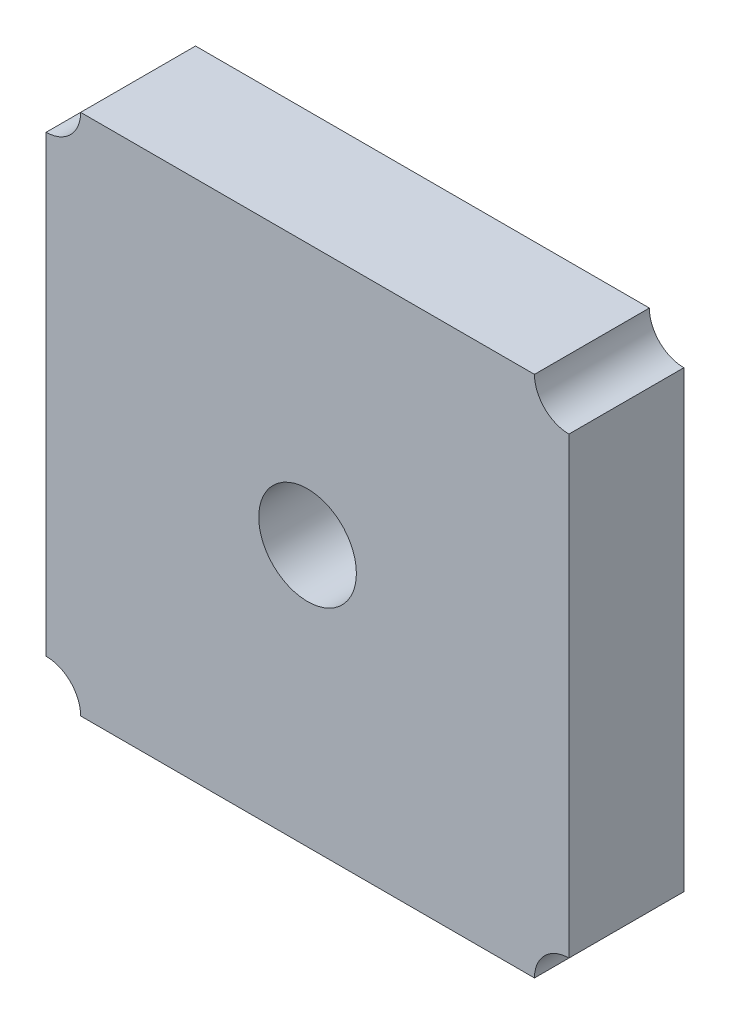
ISO-10303-21;
HEADER;
FILE_DESCRIPTION(('STEP AP214'),'2;1');
FILE_NAME('part.step','',(''),(''),'','','');
FILE_SCHEMA(('AUTOMOTIVE_DESIGN { 1 0 10303 214 1 1 1 1 }'));
ENDSEC;
DATA;
#1=APPLICATION_CONTEXT('core data for automotive mechanical design processes');
#2=APPLICATION_PROTOCOL_DEFINITION('international standard','automotive_design',2000,#1);
#3=PRODUCT_CONTEXT('',#1,'mechanical');
#4=PRODUCT('Part','Part','',(#3));
#5=PRODUCT_RELATED_PRODUCT_CATEGORY('part','',(#4));
#6=PRODUCT_DEFINITION_FORMATION('','',#4);
#7=PRODUCT_DEFINITION_CONTEXT('part definition',#1,'design');
#8=PRODUCT_DEFINITION('design','',#6,#7);
#9=PRODUCT_DEFINITION_SHAPE('','',#8);
#10=(LENGTH_UNIT() NAMED_UNIT(*) SI_UNIT(.MILLI.,.METRE.));
#11=(NAMED_UNIT(*) PLANE_ANGLE_UNIT() SI_UNIT($,.RADIAN.));
#12=(NAMED_UNIT(*) SI_UNIT($,.STERADIAN.) SOLID_ANGLE_UNIT());
#13=UNCERTAINTY_MEASURE_WITH_UNIT(LENGTH_MEASURE(1.E-05),#10,'distance_accuracy_value','');
#14=(GEOMETRIC_REPRESENTATION_CONTEXT(3) GLOBAL_UNCERTAINTY_ASSIGNED_CONTEXT((#13)) GLOBAL_UNIT_ASSIGNED_CONTEXT((#10,
#11,#12)) REPRESENTATION_CONTEXT('',''));
#15=CARTESIAN_POINT('',(0.,0.,0.));
#16=DIRECTION('',(0.,0.,1.));
#17=DIRECTION('',(1.,0.,0.));
#18=AXIS2_PLACEMENT_3D('',#15,#16,#17);
#19=CARTESIAN_POINT('',(0.,0.,10.));
#20=DIRECTION('',(0.,0.,-1.));
#21=DIRECTION('',(-1.,0.,0.));
#22=AXIS2_PLACEMENT_3D('',#19,#20,#21);
#23=CYLINDRICAL_SURFACE('',#22,3.);
#24=CARTESIAN_POINT('',(0.,0.,0.));
#25=DIRECTION('',(0.,0.,1.));
#26=DIRECTION('',(1.,0.,0.));
#27=AXIS2_PLACEMENT_3D('',#24,#25,#26);
#28=CIRCLE('',#27,3.);
#29=CARTESIAN_POINT('',(0.,-3.,0.));
#30=VERTEX_POINT('',#29);
#31=CARTESIAN_POINT('',(3.,0.,0.));
#32=VERTEX_POINT('',#31);
#33=EDGE_CURVE('E134',#30,#32,#28,.T.);
#34=ORIENTED_EDGE('',*,*,#33,.F.);
#35=DIRECTION('',(0.,0.,-1.));
#36=VECTOR('',#35,1.);
#37=CARTESIAN_POINT('',(0.,-3.,10.));
#38=LINE('',#37,#36);
#39=CARTESIAN_POINT('',(0.,-3.,10.));
#40=VERTEX_POINT('',#39);
#41=EDGE_CURVE('E11',#40,#30,#38,.T.);
#42=ORIENTED_EDGE('',*,*,#41,.F.);
#43=CARTESIAN_POINT('',(0.,0.,10.));
#44=DIRECTION('',(0.,0.,1.));
#45=DIRECTION('',(1.,0.,0.));
#46=AXIS2_PLACEMENT_3D('',#43,#44,#45);
#47=CIRCLE('',#46,3.);
#48=CARTESIAN_POINT('',(3.,0.,10.));
#49=VERTEX_POINT('',#48);
#50=EDGE_CURVE('E156',#40,#49,#47,.T.);
#51=ORIENTED_EDGE('',*,*,#50,.T.);
#52=DIRECTION('',(0.,0.,-1.));
#53=VECTOR('',#52,1.);
#54=CARTESIAN_POINT('',(3.,0.,10.));
#55=LINE('',#54,#53);
#56=EDGE_CURVE('E51',#49,#32,#55,.T.);
#57=ORIENTED_EDGE('',*,*,#56,.T.);
#58=EDGE_LOOP('',(#34,#42,#51,#57));
#59=FACE_BOUND('',#58,.T.);
#60=ADVANCED_FACE('F35',(#59),#23,.F.);
#61=CARTESIAN_POINT('',(0.,0.,10.));
#62=DIRECTION('',(1.,0.,0.));
#63=DIRECTION('',(0.,1.,0.));
#64=AXIS2_PLACEMENT_3D('',#61,#62,#63);
#65=PLANE('',#64);
#66=DIRECTION('',(0.,-1.,0.));
#67=VECTOR('',#66,1.);
#68=CARTESIAN_POINT('',(0.,0.,0.));
#69=LINE('',#68,#67);
#70=CARTESIAN_POINT('',(0.,-42.5,0.));
#71=VERTEX_POINT('',#70);
#72=EDGE_CURVE('E136',#30,#71,#69,.T.);
#73=ORIENTED_EDGE('',*,*,#72,.T.);
#74=DIRECTION('',(0.,0.,-1.));
#75=VECTOR('',#74,1.);
#76=CARTESIAN_POINT('',(0.,-42.5,10.));
#77=LINE('',#76,#75);
#78=CARTESIAN_POINT('',(0.,-42.5,10.));
#79=VERTEX_POINT('',#78);
#80=EDGE_CURVE('E43',#79,#71,#77,.T.);
#81=ORIENTED_EDGE('',*,*,#80,.F.);
#82=DIRECTION('',(0.,-1.,0.));
#83=VECTOR('',#82,1.);
#84=CARTESIAN_POINT('',(0.,0.,10.));
#85=LINE('',#84,#83);
#86=EDGE_CURVE('E277',#40,#79,#85,.T.);
#87=ORIENTED_EDGE('',*,*,#86,.F.);
#88=ORIENTED_EDGE('',*,*,#41,.T.);
#89=EDGE_LOOP('',(#73,#81,#87,#88));
#90=FACE_BOUND('',#89,.T.);
#91=ADVANCED_FACE('F173',(#90),#65,.F.);
#92=CARTESIAN_POINT('',(0.,-45.5,10.));
#93=DIRECTION('',(0.,0.,-1.));
#94=DIRECTION('',(-1.,0.,0.));
#95=AXIS2_PLACEMENT_3D('',#92,#93,#94);
#96=CYLINDRICAL_SURFACE('',#95,3.);
#97=CARTESIAN_POINT('',(0.,-45.5,0.));
#98=DIRECTION('',(0.,0.,1.));
#99=DIRECTION('',(1.,0.,0.));
#100=AXIS2_PLACEMENT_3D('',#97,#98,#99);
#101=CIRCLE('',#100,3.);
#102=CARTESIAN_POINT('',(3.,-45.5,0.));
#103=VERTEX_POINT('',#102);
#104=EDGE_CURVE('E139',#103,#71,#101,.T.);
#105=ORIENTED_EDGE('',*,*,#104,.F.);
#106=DIRECTION('',(0.,0.,-1.));
#107=VECTOR('',#106,1.);
#108=CARTESIAN_POINT('',(3.,-45.5,10.));
#109=LINE('',#108,#107);
#110=CARTESIAN_POINT('',(3.,-45.5,10.));
#111=VERTEX_POINT('',#110);
#112=EDGE_CURVE('E163',#111,#103,#109,.T.);
#113=ORIENTED_EDGE('',*,*,#112,.F.);
#114=CARTESIAN_POINT('',(0.,-45.5,10.));
#115=DIRECTION('',(0.,0.,1.));
#116=DIRECTION('',(1.,0.,0.));
#117=AXIS2_PLACEMENT_3D('',#114,#115,#116);
#118=CIRCLE('',#117,3.);
#119=EDGE_CURVE('E170',#111,#79,#118,.T.);
#120=ORIENTED_EDGE('',*,*,#119,.T.);
#121=ORIENTED_EDGE('',*,*,#80,.T.);
#122=EDGE_LOOP('',(#105,#113,#120,#121));
#123=FACE_BOUND('',#122,.T.);
#124=ADVANCED_FACE('F168',(#123),#96,.F.);
#125=CARTESIAN_POINT('',(0.,-45.5,10.));
#126=DIRECTION('',(0.,1.,0.));
#127=DIRECTION('',(0.,0.,1.));
#128=AXIS2_PLACEMENT_3D('',#125,#126,#127);
#129=PLANE('',#128);
#130=DIRECTION('',(1.,0.,0.));
#131=VECTOR('',#130,1.);
#132=CARTESIAN_POINT('',(0.,-45.5,0.));
#133=LINE('',#132,#131);
#134=CARTESIAN_POINT('',(42.5,-45.5,0.));
#135=VERTEX_POINT('',#134);
#136=EDGE_CURVE('E142',#103,#135,#133,.T.);
#137=ORIENTED_EDGE('',*,*,#136,.T.);
#138=DIRECTION('',(0.,0.,-1.));
#139=VECTOR('',#138,1.);
#140=CARTESIAN_POINT('',(42.5,-45.5,10.));
#141=LINE('',#140,#139);
#142=CARTESIAN_POINT('',(42.5,-45.5,10.));
#143=VERTEX_POINT('',#142);
#144=EDGE_CURVE('E160',#143,#135,#141,.T.);
#145=ORIENTED_EDGE('',*,*,#144,.F.);
#146=DIRECTION('',(1.,0.,0.));
#147=VECTOR('',#146,1.);
#148=CARTESIAN_POINT('',(0.,-45.5,10.));
#149=LINE('',#148,#147);
#150=EDGE_CURVE('E126',#111,#143,#149,.T.);
#151=ORIENTED_EDGE('',*,*,#150,.F.);
#152=ORIENTED_EDGE('',*,*,#112,.T.);
#153=EDGE_LOOP('',(#137,#145,#151,#152));
#154=FACE_BOUND('',#153,.T.);
#155=ADVANCED_FACE('F181',(#154),#129,.F.);
#156=CARTESIAN_POINT('',(45.5,-45.5,10.));
#157=DIRECTION('',(0.,0.,-1.));
#158=DIRECTION('',(-1.,0.,0.));
#159=AXIS2_PLACEMENT_3D('',#156,#157,#158);
#160=CYLINDRICAL_SURFACE('',#159,3.);
#161=CARTESIAN_POINT('',(45.5,-45.5,0.));
#162=DIRECTION('',(0.,0.,1.));
#163=DIRECTION('',(1.,0.,0.));
#164=AXIS2_PLACEMENT_3D('',#161,#162,#163);
#165=CIRCLE('',#164,3.);
#166=CARTESIAN_POINT('',(45.5,-42.5,0.));
#167=VERTEX_POINT('',#166);
#168=EDGE_CURVE('E144',#135,#167,#165,.F.);
#169=ORIENTED_EDGE('',*,*,#168,.T.);
#170=DIRECTION('',(0.,0.,-1.));
#171=VECTOR('',#170,1.);
#172=CARTESIAN_POINT('',(45.5,-42.5,10.));
#173=LINE('',#172,#171);
#174=CARTESIAN_POINT('',(45.5,-42.5,10.));
#175=VERTEX_POINT('',#174);
#176=EDGE_CURVE('E111',#175,#167,#173,.T.);
#177=ORIENTED_EDGE('',*,*,#176,.F.);
#178=CARTESIAN_POINT('',(45.5,-45.5,10.));
#179=DIRECTION('',(0.,0.,1.));
#180=DIRECTION('',(1.,0.,0.));
#181=AXIS2_PLACEMENT_3D('',#178,#179,#180);
#182=CIRCLE('',#181,3.);
#183=EDGE_CURVE('E123',#143,#175,#182,.F.);
#184=ORIENTED_EDGE('',*,*,#183,.F.);
#185=ORIENTED_EDGE('',*,*,#144,.T.);
#186=EDGE_LOOP('',(#169,#177,#184,#185));
#187=FACE_BOUND('',#186,.T.);
#188=ADVANCED_FACE('F184',(#187),#160,.F.);
#189=CARTESIAN_POINT('',(45.5,0.,10.));
#190=DIRECTION('',(1.,0.,0.));
#191=DIRECTION('',(0.,1.,0.));
#192=AXIS2_PLACEMENT_3D('',#189,#190,#191);
#193=PLANE('',#192);
#194=DIRECTION('',(0.,-1.,0.));
#195=VECTOR('',#194,1.);
#196=CARTESIAN_POINT('',(45.5,0.,0.));
#197=LINE('',#196,#195);
#198=CARTESIAN_POINT('',(45.5,-3.,0.));
#199=VERTEX_POINT('',#198);
#200=EDGE_CURVE('E108',#199,#167,#197,.T.);
#201=ORIENTED_EDGE('',*,*,#200,.F.);
#202=DIRECTION('',(0.,0.,-1.));
#203=VECTOR('',#202,1.);
#204=CARTESIAN_POINT('',(45.5,-3.,10.));
#205=LINE('',#204,#203);
#206=CARTESIAN_POINT('',(45.5,-3.,10.));
#207=VERTEX_POINT('',#206);
#208=EDGE_CURVE('E102',#207,#199,#205,.T.);
#209=ORIENTED_EDGE('',*,*,#208,.F.);
#210=DIRECTION('',(0.,-1.,0.));
#211=VECTOR('',#210,1.);
#212=CARTESIAN_POINT('',(45.5,0.,10.));
#213=LINE('',#212,#211);
#214=EDGE_CURVE('E106',#207,#175,#213,.T.);
#215=ORIENTED_EDGE('',*,*,#214,.T.);
#216=ORIENTED_EDGE('',*,*,#176,.T.);
#217=EDGE_LOOP('',(#201,#209,#215,#216));
#218=FACE_BOUND('',#217,.T.);
#219=ADVANCED_FACE('F104',(#218),#193,.T.);
#220=CARTESIAN_POINT('',(45.5,0.,10.));
#221=DIRECTION('',(0.,0.,-1.));
#222=DIRECTION('',(-1.,0.,0.));
#223=AXIS2_PLACEMENT_3D('',#220,#221,#222);
#224=CYLINDRICAL_SURFACE('',#223,3.);
#225=CARTESIAN_POINT('',(45.5,0.,0.));
#226=DIRECTION('',(0.,0.,1.));
#227=DIRECTION('',(1.,0.,0.));
#228=AXIS2_PLACEMENT_3D('',#225,#226,#227);
#229=CIRCLE('',#228,3.);
#230=CARTESIAN_POINT('',(42.5,0.,0.));
#231=VERTEX_POINT('',#230);
#232=EDGE_CURVE('E148',#199,#231,#229,.F.);
#233=ORIENTED_EDGE('',*,*,#232,.T.);
#234=DIRECTION('',(0.,0.,-1.));
#235=VECTOR('',#234,1.);
#236=CARTESIAN_POINT('',(42.5,0.,10.));
#237=LINE('',#236,#235);
#238=CARTESIAN_POINT('',(42.5,0.,10.));
#239=VERTEX_POINT('',#238);
#240=EDGE_CURVE('E77',#239,#231,#237,.T.);
#241=ORIENTED_EDGE('',*,*,#240,.F.);
#242=CARTESIAN_POINT('',(45.5,0.,10.));
#243=DIRECTION('',(0.,0.,1.));
#244=DIRECTION('',(1.,0.,0.));
#245=AXIS2_PLACEMENT_3D('',#242,#243,#244);
#246=CIRCLE('',#245,3.);
#247=EDGE_CURVE('E113',#207,#239,#246,.F.);
#248=ORIENTED_EDGE('',*,*,#247,.F.);
#249=ORIENTED_EDGE('',*,*,#208,.T.);
#250=EDGE_LOOP('',(#233,#241,#248,#249));
#251=FACE_BOUND('',#250,.T.);
#252=ADVANCED_FACE('F114',(#251),#224,.F.);
#253=CARTESIAN_POINT('',(0.,0.,10.));
#254=DIRECTION('',(0.,1.,0.));
#255=DIRECTION('',(0.,0.,1.));
#256=AXIS2_PLACEMENT_3D('',#253,#254,#255);
#257=PLANE('',#256);
#258=DIRECTION('',(1.,0.,0.));
#259=VECTOR('',#258,1.);
#260=CARTESIAN_POINT('',(0.,0.,0.));
#261=LINE('',#260,#259);
#262=EDGE_CURVE('E150',#32,#231,#261,.T.);
#263=ORIENTED_EDGE('',*,*,#262,.F.);
#264=ORIENTED_EDGE('',*,*,#56,.F.);
#265=DIRECTION('',(1.,0.,0.));
#266=VECTOR('',#265,1.);
#267=CARTESIAN_POINT('',(0.,0.,10.));
#268=LINE('',#267,#266);
#269=EDGE_CURVE('E117',#49,#239,#268,.T.);
#270=ORIENTED_EDGE('',*,*,#269,.T.);
#271=ORIENTED_EDGE('',*,*,#240,.T.);
#272=EDGE_LOOP('',(#263,#264,#270,#271));
#273=FACE_BOUND('',#272,.T.);
#274=ADVANCED_FACE('F185',(#273),#257,.T.);
#275=CARTESIAN_POINT('',(22.75,-22.75,10.));
#276=DIRECTION('',(0.,0.,-1.));
#277=DIRECTION('',(-1.,0.,0.));
#278=AXIS2_PLACEMENT_3D('',#275,#276,#277);
#279=CYLINDRICAL_SURFACE('',#278,4.25);
#280=CARTESIAN_POINT('',(22.75,-22.75,10.));
#281=DIRECTION('',(0.,0.,1.));
#282=DIRECTION('',(1.,0.,0.));
#283=AXIS2_PLACEMENT_3D('',#280,#281,#282);
#284=CIRCLE('',#283,4.25);
#285=CARTESIAN_POINT('',(27.,-22.75,10.));
#286=VERTEX_POINT('',#285);
#287=EDGE_CURVE('E131',#286,#286,#284,.T.);
#288=ORIENTED_EDGE('',*,*,#287,.T.);
#289=EDGE_LOOP('',(#288));
#290=FACE_BOUND('',#289,.T.);
#291=CARTESIAN_POINT('',(22.75,-22.75,0.));
#292=DIRECTION('',(0.,0.,1.));
#293=DIRECTION('',(1.,0.,0.));
#294=AXIS2_PLACEMENT_3D('',#291,#292,#293);
#295=CIRCLE('',#294,4.25);
#296=CARTESIAN_POINT('',(27.,-22.75,0.));
#297=VERTEX_POINT('',#296);
#298=EDGE_CURVE('E153',#297,#297,#295,.T.);
#299=ORIENTED_EDGE('',*,*,#298,.F.);
#300=EDGE_LOOP('',(#299));
#301=FACE_BOUND('',#300,.T.);
#302=ADVANCED_FACE('F187',(#290,#301),#279,.F.);
#303=CARTESIAN_POINT('',(0.,0.,10.));
#304=DIRECTION('',(0.,0.,1.));
#305=DIRECTION('',(1.,0.,0.));
#306=AXIS2_PLACEMENT_3D('',#303,#304,#305);
#307=PLANE('',#306);
#308=ORIENTED_EDGE('',*,*,#50,.F.);
#309=ORIENTED_EDGE('',*,*,#86,.T.);
#310=ORIENTED_EDGE('',*,*,#119,.F.);
#311=ORIENTED_EDGE('',*,*,#150,.T.);
#312=ORIENTED_EDGE('',*,*,#183,.T.);
#313=ORIENTED_EDGE('',*,*,#214,.F.);
#314=ORIENTED_EDGE('',*,*,#247,.T.);
#315=ORIENTED_EDGE('',*,*,#269,.F.);
#316=EDGE_LOOP('',(#308,#309,#310,#311,#312,#313,#314,#315));
#317=FACE_BOUND('',#316,.T.);
#318=ORIENTED_EDGE('',*,*,#287,.F.);
#319=EDGE_LOOP('',(#318));
#320=FACE_BOUND('',#319,.T.);
#321=ADVANCED_FACE('F120',(#317,#320),#307,.T.);
#322=CARTESIAN_POINT('',(0.,0.,0.));
#323=DIRECTION('',(0.,0.,1.));
#324=DIRECTION('',(1.,0.,0.));
#325=AXIS2_PLACEMENT_3D('',#322,#323,#324);
#326=PLANE('',#325);
#327=ORIENTED_EDGE('',*,*,#33,.T.);
#328=ORIENTED_EDGE('',*,*,#262,.T.);
#329=ORIENTED_EDGE('',*,*,#232,.F.);
#330=ORIENTED_EDGE('',*,*,#200,.T.);
#331=ORIENTED_EDGE('',*,*,#168,.F.);
#332=ORIENTED_EDGE('',*,*,#136,.F.);
#333=ORIENTED_EDGE('',*,*,#104,.T.);
#334=ORIENTED_EDGE('',*,*,#72,.F.);
#335=EDGE_LOOP('',(#327,#328,#329,#330,#331,#332,#333,#334));
#336=FACE_BOUND('',#335,.T.);
#337=ORIENTED_EDGE('',*,*,#298,.T.);
#338=EDGE_LOOP('',(#337));
#339=FACE_BOUND('',#338,.T.);
#340=ADVANCED_FACE('F176',(#336,#339),#326,.F.);
#341=CLOSED_SHELL('',(#60,#91,#124,#155,#188,#219,#252,#274,#302,#321,#340));
#342=MANIFOLD_SOLID_BREP('B2',#341);
#343=ADVANCED_BREP_SHAPE_REPRESENTATION('',(#18,#342),#14);
#344=SHAPE_DEFINITION_REPRESENTATION(#9,#343);
ENDSEC;
END-ISO-10303-21;
